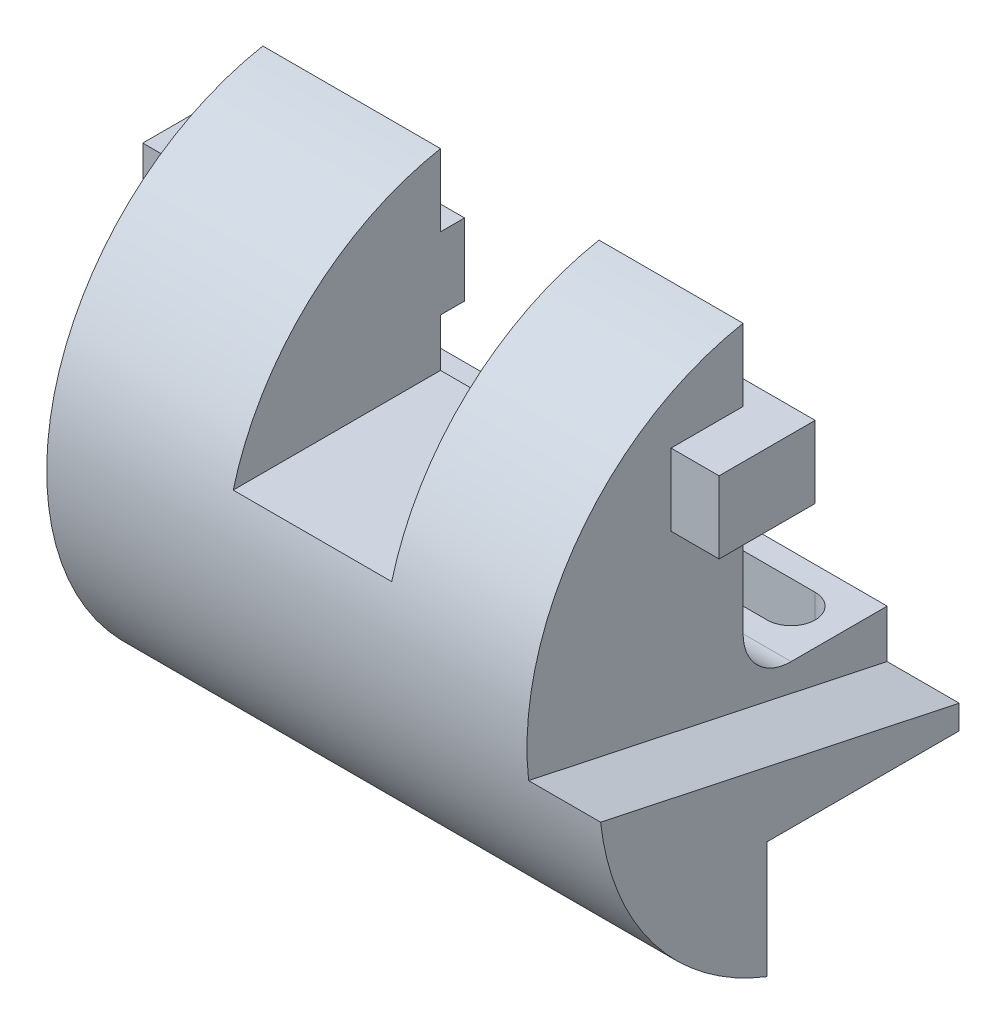
ISO-10303-21;
HEADER;
FILE_DESCRIPTION(('STEP AP214'),'2;1');
FILE_NAME('part.step','',(''),(''),'','','');
FILE_SCHEMA(('AUTOMOTIVE_DESIGN { 1 0 10303 214 1 1 1 1 }'));
ENDSEC;
DATA;
#1=APPLICATION_CONTEXT('core data for automotive mechanical design processes');
#2=APPLICATION_PROTOCOL_DEFINITION('international standard','automotive_design',2000,#1);
#3=PRODUCT_CONTEXT('',#1,'mechanical');
#4=PRODUCT('Part','Part','',(#3));
#5=PRODUCT_RELATED_PRODUCT_CATEGORY('part','',(#4));
#6=PRODUCT_DEFINITION_FORMATION('','',#4);
#7=PRODUCT_DEFINITION_CONTEXT('part definition',#1,'design');
#8=PRODUCT_DEFINITION('design','',#6,#7);
#9=PRODUCT_DEFINITION_SHAPE('','',#8);
#10=(LENGTH_UNIT() NAMED_UNIT(*) SI_UNIT(.MILLI.,.METRE.));
#11=(NAMED_UNIT(*) PLANE_ANGLE_UNIT() SI_UNIT($,.RADIAN.));
#12=(NAMED_UNIT(*) SI_UNIT($,.STERADIAN.) SOLID_ANGLE_UNIT());
#13=UNCERTAINTY_MEASURE_WITH_UNIT(LENGTH_MEASURE(1.E-05),#10,'distance_accuracy_value','');
#14=(GEOMETRIC_REPRESENTATION_CONTEXT(3) GLOBAL_UNCERTAINTY_ASSIGNED_CONTEXT((#13)) GLOBAL_UNIT_ASSIGNED_CONTEXT((#10,
#11,#12)) REPRESENTATION_CONTEXT('',''));
#15=CARTESIAN_POINT('',(0.,0.,0.));
#16=DIRECTION('',(0.,0.,1.));
#17=DIRECTION('',(1.,0.,0.));
#18=AXIS2_PLACEMENT_3D('',#15,#16,#17);
#19=CARTESIAN_POINT('',(115.,54.0832691319598,10.));
#20=DIRECTION('',(0.,0.,1.));
#21=DIRECTION('',(0.,-1.,0.));
#22=AXIS2_PLACEMENT_3D('',#19,#20,#21);
#23=PLANE('',#22);
#24=DIRECTION('',(0.,-1.,0.));
#25=VECTOR('',#24,1.);
#26=CARTESIAN_POINT('',(70.,54.0832691319598,10.));
#27=LINE('',#26,#25);
#28=CARTESIAN_POINT('',(70.,24.0832691319598,9.99999999999999));
#29=VERTEX_POINT('',#28);
#30=CARTESIAN_POINT('',(70.,14.0832691319598,9.99999999999999));
#31=VERTEX_POINT('',#30);
#32=EDGE_CURVE('E319',#29,#31,#27,.T.);
#33=ORIENTED_EDGE('',*,*,#32,.F.);
#34=DIRECTION('',(1.,0.,0.));
#35=VECTOR('',#34,1.);
#36=CARTESIAN_POINT('',(115.,24.0832691319598,10.));
#37=LINE('',#36,#35);
#38=CARTESIAN_POINT('',(100.,24.0832691319598,9.99999999999999));
#39=VERTEX_POINT('',#38);
#40=EDGE_CURVE('E279',#29,#39,#37,.T.);
#41=ORIENTED_EDGE('',*,*,#40,.T.);
#42=DIRECTION('',(0.,1.,0.));
#43=VECTOR('',#42,1.);
#44=CARTESIAN_POINT('',(100.,54.0832691319598,10.));
#45=LINE('',#44,#43);
#46=CARTESIAN_POINT('',(100.,-1.91673086804016,9.99999999999999));
#47=VERTEX_POINT('',#46);
#48=EDGE_CURVE('E382',#47,#39,#45,.T.);
#49=ORIENTED_EDGE('',*,*,#48,.F.);
#50=DIRECTION('',(-1.,0.,0.));
#51=VECTOR('',#50,1.);
#52=CARTESIAN_POINT('',(115.,-1.91673086804016,9.99999999999999));
#53=LINE('',#52,#51);
#54=CARTESIAN_POINT('',(0.,-1.91673086804016,9.99999999999999));
#55=VERTEX_POINT('',#54);
#56=EDGE_CURVE('E430',#47,#55,#53,.T.);
#57=ORIENTED_EDGE('',*,*,#56,.T.);
#58=DIRECTION('',(0.,1.,0.));
#59=VECTOR('',#58,1.);
#60=CARTESIAN_POINT('',(0.,54.0832691319598,10.));
#61=LINE('',#60,#59);
#62=CARTESIAN_POINT('',(0.,24.0832691319598,10.));
#63=VERTEX_POINT('',#62);
#64=EDGE_CURVE('E401',#55,#63,#61,.T.);
#65=ORIENTED_EDGE('',*,*,#64,.T.);
#66=DIRECTION('',(-1.,0.,0.));
#67=VECTOR('',#66,1.);
#68=CARTESIAN_POINT('',(37.,24.0832691319598,10.));
#69=LINE('',#68,#67);
#70=CARTESIAN_POINT('',(37.,24.0832691319598,10.));
#71=VERTEX_POINT('',#70);
#72=EDGE_CURVE('E304',#71,#63,#69,.T.);
#73=ORIENTED_EDGE('',*,*,#72,.F.);
#74=DIRECTION('',(0.,1.,0.));
#75=VECTOR('',#74,1.);
#76=CARTESIAN_POINT('',(37.,54.0832691319598,10.));
#77=LINE('',#76,#75);
#78=CARTESIAN_POINT('',(37.,14.0832691319598,9.99999999999999));
#79=VERTEX_POINT('',#78);
#80=EDGE_CURVE('E325',#79,#71,#77,.T.);
#81=ORIENTED_EDGE('',*,*,#80,.F.);
#82=DIRECTION('',(-1.,0.,0.));
#83=VECTOR('',#82,1.);
#84=CARTESIAN_POINT('',(70.,14.0832691319598,9.99999999999999));
#85=LINE('',#84,#83);
#86=EDGE_CURVE('E321',#31,#79,#85,.T.);
#87=ORIENTED_EDGE('',*,*,#86,.F.);
#88=EDGE_LOOP('',(#33,#41,#49,#57,#65,#73,#81,#87));
#89=FACE_BOUND('',#88,.T.);
#90=ADVANCED_FACE('F41',(#89),#23,.F.);
#91=CARTESIAN_POINT('',(0.,0.,0.));
#92=DIRECTION('',(1.,0.,0.));
#93=DIRECTION('',(0.,0.,-1.));
#94=AXIS2_PLACEMENT_3D('',#91,#92,#93);
#95=PLANE('',#94);
#96=DIRECTION('',(0.,0.,1.));
#97=VECTOR('',#96,1.);
#98=CARTESIAN_POINT('',(0.,24.0832691319598,10.));
#99=LINE('',#98,#97);
#100=CARTESIAN_POINT('',(0.,24.0832691319598,25.));
#101=VERTEX_POINT('',#100);
#102=EDGE_CURVE('E285',#63,#101,#99,.T.);
#103=ORIENTED_EDGE('',*,*,#102,.F.);
#104=ORIENTED_EDGE('',*,*,#64,.F.);
#105=CARTESIAN_POINT('',(0.,-1.91673086804016,0.));
#106=DIRECTION('',(-1.,0.,0.));
#107=DIRECTION('',(0.,0.,1.));
#108=AXIS2_PLACEMENT_3D('',#105,#106,#107);
#109=CIRCLE('',#108,10.);
#110=CARTESIAN_POINT('',(0.,-11.9167308680402,0.));
#111=VERTEX_POINT('',#110);
#112=EDGE_CURVE('E421',#111,#55,#109,.T.);
#113=ORIENTED_EDGE('',*,*,#112,.F.);
#114=DIRECTION('',(0.,0.,1.));
#115=VECTOR('',#114,1.);
#116=CARTESIAN_POINT('',(0.,-11.9167308680402,0.));
#117=LINE('',#116,#115);
#118=CARTESIAN_POINT('',(0.,-11.9167308680402,-20.));
#119=VERTEX_POINT('',#118);
#120=EDGE_CURVE('E418',#119,#111,#117,.T.);
#121=ORIENTED_EDGE('',*,*,#120,.F.);
#122=DIRECTION('',(0.,1.,0.));
#123=VECTOR('',#122,1.);
#124=CARTESIAN_POINT('',(0.,-11.9167308680402,-20.));
#125=LINE('',#124,#123);
#126=CARTESIAN_POINT('',(0.,-26.9167308680402,-20.));
#127=VERTEX_POINT('',#126);
#128=EDGE_CURVE('E415',#127,#119,#125,.T.);
#129=ORIENTED_EDGE('',*,*,#128,.F.);
#130=DIRECTION('',(0.,0.,-1.));
#131=VECTOR('',#130,1.);
#132=CARTESIAN_POINT('',(0.,-26.9167308680402,-20.));
#133=LINE('',#132,#131);
#134=CARTESIAN_POINT('',(0.,-26.9167308680402,20.));
#135=VERTEX_POINT('',#134);
#136=EDGE_CURVE('E413',#135,#127,#133,.T.);
#137=ORIENTED_EDGE('',*,*,#136,.F.);
#138=DIRECTION('',(0.,1.,0.));
#139=VECTOR('',#138,1.);
#140=CARTESIAN_POINT('',(0.,-26.9167308680402,20.));
#141=LINE('',#140,#139);
#142=CARTESIAN_POINT('',(0.,-51.234753829798,20.));
#143=VERTEX_POINT('',#142);
#144=EDGE_CURVE('E411',#143,#135,#141,.T.);
#145=ORIENTED_EDGE('',*,*,#144,.F.);
#146=CARTESIAN_POINT('',(0.,0.,0.));
#147=DIRECTION('',(1.,0.,0.));
#148=DIRECTION('',(0.,0.,-1.));
#149=AXIS2_PLACEMENT_3D('',#146,#147,#148);
#150=CIRCLE('',#149,55.);
#151=CARTESIAN_POINT('',(0.,54.0832691319598,10.));
#152=VERTEX_POINT('',#151);
#153=EDGE_CURVE('E397',#152,#143,#150,.T.);
#154=ORIENTED_EDGE('',*,*,#153,.F.);
#155=CARTESIAN_POINT('',(0.,39.0832691319598,10.));
#156=VERTEX_POINT('',#155);
#157=EDGE_CURVE('E424',#156,#152,#61,.T.);
#158=ORIENTED_EDGE('',*,*,#157,.F.);
#159=DIRECTION('',(0.,0.,-1.));
#160=VECTOR('',#159,1.);
#161=CARTESIAN_POINT('',(0.,39.0832691319598,10.));
#162=LINE('',#161,#160);
#163=CARTESIAN_POINT('',(0.,39.0832691319598,25.));
#164=VERTEX_POINT('',#163);
#165=EDGE_CURVE('E289',#164,#156,#162,.T.);
#166=ORIENTED_EDGE('',*,*,#165,.F.);
#167=DIRECTION('',(0.,1.,0.));
#168=VECTOR('',#167,1.);
#169=CARTESIAN_POINT('',(0.,39.0832691319598,25.));
#170=LINE('',#169,#168);
#171=EDGE_CURVE('E296',#101,#164,#170,.T.);
#172=ORIENTED_EDGE('',*,*,#171,.F.);
#173=EDGE_LOOP('',(#103,#104,#113,#121,#129,#137,#145,#154,#158,#166,#172));
#174=FACE_BOUND('',#173,.T.);
#175=ADVANCED_FACE('F449',(#174),#95,.F.);
#176=CARTESIAN_POINT('',(100.,39.0832691319598,9.99999999999999));
#177=VERTEX_POINT('',#176);
#178=CARTESIAN_POINT('',(100.,54.0832691319598,9.99999999999999));
#179=VERTEX_POINT('',#178);
#180=EDGE_CURVE('E381',#177,#179,#45,.T.);
#181=ORIENTED_EDGE('',*,*,#180,.F.);
#182=DIRECTION('',(-1.,0.,0.));
#183=VECTOR('',#182,1.);
#184=CARTESIAN_POINT('',(115.,39.0832691319598,10.));
#185=LINE('',#184,#183);
#186=CARTESIAN_POINT('',(70.,39.0832691319598,9.99999999999999));
#187=VERTEX_POINT('',#186);
#188=EDGE_CURVE('E274',#177,#187,#185,.T.);
#189=ORIENTED_EDGE('',*,*,#188,.T.);
#190=CARTESIAN_POINT('',(70.,54.0832691319598,10.));
#191=VERTEX_POINT('',#190);
#192=EDGE_CURVE('E234',#191,#187,#27,.T.);
#193=ORIENTED_EDGE('',*,*,#192,.F.);
#194=DIRECTION('',(-1.,0.,0.));
#195=VECTOR('',#194,1.);
#196=CARTESIAN_POINT('',(115.,54.0832691319598,10.));
#197=LINE('',#196,#195);
#198=EDGE_CURVE('E427',#179,#191,#197,.T.);
#199=ORIENTED_EDGE('',*,*,#198,.F.);
#200=EDGE_LOOP('',(#181,#189,#193,#199));
#201=FACE_BOUND('',#200,.T.);
#202=ADVANCED_FACE('F508',(#201),#23,.F.);
#203=DIRECTION('',(1.,0.,0.));
#204=VECTOR('',#203,1.);
#205=CARTESIAN_POINT('',(37.,39.0832691319598,10.));
#206=LINE('',#205,#204);
#207=CARTESIAN_POINT('',(37.,39.0832691319598,10.));
#208=VERTEX_POINT('',#207);
#209=EDGE_CURVE('E309',#156,#208,#206,.T.);
#210=ORIENTED_EDGE('',*,*,#209,.F.);
#211=ORIENTED_EDGE('',*,*,#157,.T.);
#212=CARTESIAN_POINT('',(37.,54.0832691319598,10.));
#213=VERTEX_POINT('',#212);
#214=EDGE_CURVE('E408',#213,#152,#197,.T.);
#215=ORIENTED_EDGE('',*,*,#214,.F.);
#216=EDGE_CURVE('E324',#208,#213,#77,.T.);
#217=ORIENTED_EDGE('',*,*,#216,.F.);
#218=EDGE_LOOP('',(#210,#211,#215,#217));
#219=FACE_BOUND('',#218,.T.);
#220=ADVANCED_FACE('F473',(#219),#23,.F.);
#221=CARTESIAN_POINT('',(115.,0.,0.));
#222=DIRECTION('',(-1.,0.,0.));
#223=DIRECTION('',(0.,0.,1.));
#224=AXIS2_PLACEMENT_3D('',#221,#222,#223);
#225=CYLINDRICAL_SURFACE('',#224,55.);
#226=ORIENTED_EDGE('',*,*,#198,.T.);
#227=CARTESIAN_POINT('',(70.,0.,0.));
#228=DIRECTION('',(1.,0.,0.));
#229=DIRECTION('',(0.,0.,-1.));
#230=AXIS2_PLACEMENT_3D('',#227,#228,#229);
#231=CIRCLE('',#230,55.);
#232=CARTESIAN_POINT('',(70.,14.0832691319598,53.166357130772));
#233=VERTEX_POINT('',#232);
#234=EDGE_CURVE('E339',#191,#233,#231,.T.);
#235=ORIENTED_EDGE('',*,*,#234,.T.);
#236=DIRECTION('',(-1.,0.,0.));
#237=VECTOR('',#236,1.);
#238=CARTESIAN_POINT('',(115.,14.0832691319598,53.166357130772));
#239=LINE('',#238,#237);
#240=CARTESIAN_POINT('',(37.,14.0832691319598,53.166357130772));
#241=VERTEX_POINT('',#240);
#242=EDGE_CURVE('E331',#233,#241,#239,.T.);
#243=ORIENTED_EDGE('',*,*,#242,.T.);
#244=CARTESIAN_POINT('',(37.,0.,0.));
#245=DIRECTION('',(-1.,0.,0.));
#246=DIRECTION('',(0.,0.,1.));
#247=AXIS2_PLACEMENT_3D('',#244,#245,#246);
#248=CIRCLE('',#247,55.);
#249=EDGE_CURVE('E336',#241,#213,#248,.T.);
#250=ORIENTED_EDGE('',*,*,#249,.T.);
#251=ORIENTED_EDGE('',*,*,#214,.T.);
#252=ORIENTED_EDGE('',*,*,#153,.T.);
#253=DIRECTION('',(-1.,0.,0.));
#254=VECTOR('',#253,1.);
#255=CARTESIAN_POINT('',(115.,-51.234753829798,20.));
#256=LINE('',#255,#254);
#257=CARTESIAN_POINT('',(115.,-51.234753829798,20.));
#258=VERTEX_POINT('',#257);
#259=EDGE_CURVE('E11',#258,#143,#256,.T.);
#260=ORIENTED_EDGE('',*,*,#259,.F.);
#261=CARTESIAN_POINT('',(115.,0.,0.));
#262=DIRECTION('',(1.,0.,0.));
#263=DIRECTION('',(0.,0.,-1.));
#264=AXIS2_PLACEMENT_3D('',#261,#262,#263);
#265=CIRCLE('',#264,55.);
#266=CARTESIAN_POINT('',(115.,-6.04583423455262,54.6666981663271));
#267=VERTEX_POINT('',#266);
#268=EDGE_CURVE('E398',#267,#258,#265,.T.);
#269=ORIENTED_EDGE('',*,*,#268,.F.);
#270=DIRECTION('',(1.,0.,0.));
#271=VECTOR('',#270,1.);
#272=CARTESIAN_POINT('',(100.,-6.0458342345526,54.6666981663271));
#273=LINE('',#272,#271);
#274=CARTESIAN_POINT('',(100.,-6.0458342345526,54.6666981663271));
#275=VERTEX_POINT('',#274);
#276=EDGE_CURVE('E388',#275,#267,#273,.T.);
#277=ORIENTED_EDGE('',*,*,#276,.F.);
#278=CARTESIAN_POINT('',(100.,0.,0.));
#279=DIRECTION('',(-1.,0.,0.));
#280=DIRECTION('',(0.,0.,1.));
#281=AXIS2_PLACEMENT_3D('',#278,#279,#280);
#282=CIRCLE('',#281,55.);
#283=EDGE_CURVE('E393',#275,#179,#282,.T.);
#284=ORIENTED_EDGE('',*,*,#283,.T.);
#285=EDGE_LOOP('',(#226,#235,#243,#250,#251,#252,#260,#269,#277,#284));
#286=FACE_BOUND('',#285,.T.);
#287=ADVANCED_FACE('F43',(#286),#225,.T.);
#288=CARTESIAN_POINT('',(115.,-26.9167308680402,20.));
#289=DIRECTION('',(0.,0.,1.));
#290=DIRECTION('',(1.,0.,0.));
#291=AXIS2_PLACEMENT_3D('',#288,#289,#290);
#292=PLANE('',#291);
#293=ORIENTED_EDGE('',*,*,#144,.T.);
#294=DIRECTION('',(-1.,0.,0.));
#295=VECTOR('',#294,1.);
#296=CARTESIAN_POINT('',(115.,-26.9167308680402,20.));
#297=LINE('',#296,#295);
#298=CARTESIAN_POINT('',(115.,-26.9167308680402,20.));
#299=VERTEX_POINT('',#298);
#300=EDGE_CURVE('E49',#299,#135,#297,.T.);
#301=ORIENTED_EDGE('',*,*,#300,.F.);
#302=DIRECTION('',(0.,1.,0.));
#303=VECTOR('',#302,1.);
#304=CARTESIAN_POINT('',(115.,-26.9167308680402,20.));
#305=LINE('',#304,#303);
#306=EDGE_CURVE('E400',#258,#299,#305,.T.);
#307=ORIENTED_EDGE('',*,*,#306,.F.);
#308=ORIENTED_EDGE('',*,*,#259,.T.);
#309=EDGE_LOOP('',(#293,#301,#307,#308));
#310=FACE_BOUND('',#309,.T.);
#311=ADVANCED_FACE('F463',(#310),#292,.F.);
#312=CARTESIAN_POINT('',(115.,-26.9167308680402,-20.));
#313=DIRECTION('',(0.,1.,0.));
#314=DIRECTION('',(0.,0.,1.));
#315=AXIS2_PLACEMENT_3D('',#312,#313,#314);
#316=PLANE('',#315);
#317=DIRECTION('',(-1.,0.,0.));
#318=VECTOR('',#317,1.);
#319=CARTESIAN_POINT('',(115.,-26.9167308680402,-15.));
#320=LINE('',#319,#318);
#321=CARTESIAN_POINT('',(90.,-26.9167308680402,-15.));
#322=VERTEX_POINT('',#321);
#323=CARTESIAN_POINT('',(10.,-26.9167308680402,-15.));
#324=VERTEX_POINT('',#323);
#325=EDGE_CURVE('E368',#322,#324,#320,.T.);
#326=ORIENTED_EDGE('',*,*,#325,.T.);
#327=CARTESIAN_POINT('',(10.,-26.9167308680402,-10.));
#328=DIRECTION('',(0.,1.,0.));
#329=DIRECTION('',(0.,0.,1.));
#330=AXIS2_PLACEMENT_3D('',#327,#328,#329);
#331=CIRCLE('',#330,5.);
#332=CARTESIAN_POINT('',(10.,-26.9167308680402,-5.));
#333=VERTEX_POINT('',#332);
#334=EDGE_CURVE('E371',#324,#333,#331,.T.);
#335=ORIENTED_EDGE('',*,*,#334,.T.);
#336=DIRECTION('',(1.,0.,0.));
#337=VECTOR('',#336,1.);
#338=CARTESIAN_POINT('',(115.,-26.9167308680402,-5.));
#339=LINE('',#338,#337);
#340=CARTESIAN_POINT('',(90.,-26.9167308680402,-5.));
#341=VERTEX_POINT('',#340);
#342=EDGE_CURVE('E356',#333,#341,#339,.T.);
#343=ORIENTED_EDGE('',*,*,#342,.T.);
#344=CARTESIAN_POINT('',(90.,-26.9167308680402,-10.));
#345=DIRECTION('',(0.,1.,0.));
#346=DIRECTION('',(0.,0.,1.));
#347=AXIS2_PLACEMENT_3D('',#344,#345,#346);
#348=CIRCLE('',#347,5.);
#349=EDGE_CURVE('E365',#341,#322,#348,.T.);
#350=ORIENTED_EDGE('',*,*,#349,.T.);
#351=EDGE_LOOP('',(#326,#335,#343,#350));
#352=FACE_BOUND('',#351,.T.);
#353=ORIENTED_EDGE('',*,*,#136,.T.);
#354=DIRECTION('',(-1.,0.,0.));
#355=VECTOR('',#354,1.);
#356=CARTESIAN_POINT('',(115.,-26.9167308680402,-20.));
#357=LINE('',#356,#355);
#358=CARTESIAN_POINT('',(115.,-26.9167308680402,-20.));
#359=VERTEX_POINT('',#358);
#360=EDGE_CURVE('E436',#359,#127,#357,.T.);
#361=ORIENTED_EDGE('',*,*,#360,.F.);
#362=DIRECTION('',(0.,0.,-1.));
#363=VECTOR('',#362,1.);
#364=CARTESIAN_POINT('',(115.,-26.9167308680402,-20.));
#365=LINE('',#364,#363);
#366=EDGE_CURVE('E403',#299,#359,#365,.T.);
#367=ORIENTED_EDGE('',*,*,#366,.F.);
#368=ORIENTED_EDGE('',*,*,#300,.T.);
#369=EDGE_LOOP('',(#353,#361,#367,#368));
#370=FACE_BOUND('',#369,.T.);
#371=ADVANCED_FACE('F443',(#352,#370),#316,.F.);
#372=CARTESIAN_POINT('',(115.,-11.9167308680402,-20.));
#373=DIRECTION('',(0.,0.,1.));
#374=DIRECTION('',(0.,-1.,0.));
#375=AXIS2_PLACEMENT_3D('',#372,#373,#374);
#376=PLANE('',#375);
#377=DIRECTION('',(0.,1.,0.));
#378=VECTOR('',#377,1.);
#379=CARTESIAN_POINT('',(100.,-11.9167308680402,-20.));
#380=LINE('',#379,#378);
#381=CARTESIAN_POINT('',(100.,-21.9167308680402,-20.));
#382=VERTEX_POINT('',#381);
#383=CARTESIAN_POINT('',(100.,-11.9167308680402,-20.));
#384=VERTEX_POINT('',#383);
#385=EDGE_CURVE('E375',#382,#384,#380,.T.);
#386=ORIENTED_EDGE('',*,*,#385,.F.);
#387=DIRECTION('',(1.,0.,0.));
#388=VECTOR('',#387,1.);
#389=CARTESIAN_POINT('',(100.,-21.9167308680402,-20.));
#390=LINE('',#389,#388);
#391=CARTESIAN_POINT('',(115.,-21.9167308680402,-20.));
#392=VERTEX_POINT('',#391);
#393=EDGE_CURVE('E390',#382,#392,#390,.T.);
#394=ORIENTED_EDGE('',*,*,#393,.T.);
#395=DIRECTION('',(0.,1.,0.));
#396=VECTOR('',#395,1.);
#397=CARTESIAN_POINT('',(115.,-11.9167308680402,-20.));
#398=LINE('',#397,#396);
#399=EDGE_CURVE('E405',#359,#392,#398,.T.);
#400=ORIENTED_EDGE('',*,*,#399,.F.);
#401=ORIENTED_EDGE('',*,*,#360,.T.);
#402=ORIENTED_EDGE('',*,*,#128,.T.);
#403=DIRECTION('',(-1.,0.,0.));
#404=VECTOR('',#403,1.);
#405=CARTESIAN_POINT('',(115.,-11.9167308680402,-20.));
#406=LINE('',#405,#404);
#407=EDGE_CURVE('E434',#384,#119,#406,.T.);
#408=ORIENTED_EDGE('',*,*,#407,.F.);
#409=EDGE_LOOP('',(#386,#394,#400,#401,#402,#408));
#410=FACE_BOUND('',#409,.T.);
#411=ADVANCED_FACE('F456',(#410),#376,.F.);
#412=CARTESIAN_POINT('',(115.,-11.9167308680402,0.));
#413=DIRECTION('',(0.,-1.,0.));
#414=DIRECTION('',(0.,0.,-1.));
#415=AXIS2_PLACEMENT_3D('',#412,#413,#414);
#416=PLANE('',#415);
#417=DIRECTION('',(1.,0.,0.));
#418=VECTOR('',#417,1.);
#419=CARTESIAN_POINT('',(10.,-11.9167308680402,-5.));
#420=LINE('',#419,#418);
#421=CARTESIAN_POINT('',(10.,-11.9167308680402,-5.));
#422=VERTEX_POINT('',#421);
#423=CARTESIAN_POINT('',(90.,-11.9167308680402,-5.));
#424=VERTEX_POINT('',#423);
#425=EDGE_CURVE('E344',#422,#424,#420,.T.);
#426=ORIENTED_EDGE('',*,*,#425,.F.);
#427=CARTESIAN_POINT('',(10.,-11.9167308680402,-10.));
#428=DIRECTION('',(0.,1.,0.));
#429=DIRECTION('',(0.,0.,1.));
#430=AXIS2_PLACEMENT_3D('',#427,#428,#429);
#431=CIRCLE('',#430,5.);
#432=CARTESIAN_POINT('',(10.,-11.9167308680402,-15.));
#433=VERTEX_POINT('',#432);
#434=EDGE_CURVE('E342',#433,#422,#431,.T.);
#435=ORIENTED_EDGE('',*,*,#434,.F.);
#436=DIRECTION('',(-1.,0.,0.));
#437=VECTOR('',#436,1.);
#438=CARTESIAN_POINT('',(10.,-11.9167308680402,-15.));
#439=LINE('',#438,#437);
#440=CARTESIAN_POINT('',(90.,-11.9167308680402,-15.));
#441=VERTEX_POINT('',#440);
#442=EDGE_CURVE('E350',#441,#433,#439,.T.);
#443=ORIENTED_EDGE('',*,*,#442,.F.);
#444=CARTESIAN_POINT('',(90.,-11.9167308680402,-10.));
#445=DIRECTION('',(0.,1.,0.));
#446=DIRECTION('',(0.,0.,1.));
#447=AXIS2_PLACEMENT_3D('',#444,#445,#446);
#448=CIRCLE('',#447,5.);
#449=EDGE_CURVE('E347',#424,#441,#448,.T.);
#450=ORIENTED_EDGE('',*,*,#449,.F.);
#451=EDGE_LOOP('',(#426,#435,#443,#450));
#452=FACE_BOUND('',#451,.T.);
#453=DIRECTION('',(-1.,0.,0.));
#454=VECTOR('',#453,1.);
#455=CARTESIAN_POINT('',(115.,-11.9167308680402,0.));
#456=LINE('',#455,#454);
#457=CARTESIAN_POINT('',(100.,-11.9167308680402,0.));
#458=VERTEX_POINT('',#457);
#459=EDGE_CURVE('E432',#458,#111,#456,.T.);
#460=ORIENTED_EDGE('',*,*,#459,.F.);
#461=DIRECTION('',(0.,0.,1.));
#462=VECTOR('',#461,1.);
#463=CARTESIAN_POINT('',(100.,-11.9167308680402,0.));
#464=LINE('',#463,#462);
#465=EDGE_CURVE('E377',#384,#458,#464,.T.);
#466=ORIENTED_EDGE('',*,*,#465,.F.);
#467=ORIENTED_EDGE('',*,*,#407,.T.);
#468=ORIENTED_EDGE('',*,*,#120,.T.);
#469=EDGE_LOOP('',(#460,#466,#467,#468));
#470=FACE_BOUND('',#469,.T.);
#471=ADVANCED_FACE('F499',(#452,#470),#416,.F.);
#472=CARTESIAN_POINT('',(115.,-1.91673086804016,0.));
#473=DIRECTION('',(-1.,0.,0.));
#474=DIRECTION('',(0.,0.,1.));
#475=AXIS2_PLACEMENT_3D('',#472,#473,#474);
#476=CYLINDRICAL_SURFACE('',#475,10.);
#477=ORIENTED_EDGE('',*,*,#56,.F.);
#478=CARTESIAN_POINT('',(100.,-1.91673086804016,0.));
#479=DIRECTION('',(-1.,0.,0.));
#480=DIRECTION('',(0.,0.,-1.));
#481=AXIS2_PLACEMENT_3D('',#478,#479,#480);
#482=CIRCLE('',#481,10.);
#483=EDGE_CURVE('E379',#458,#47,#482,.T.);
#484=ORIENTED_EDGE('',*,*,#483,.F.);
#485=ORIENTED_EDGE('',*,*,#459,.T.);
#486=ORIENTED_EDGE('',*,*,#112,.T.);
#487=EDGE_LOOP('',(#477,#484,#485,#486));
#488=FACE_BOUND('',#487,.T.);
#489=ADVANCED_FACE('F495',(#488),#476,.F.);
#490=CARTESIAN_POINT('',(115.,0.,0.));
#491=DIRECTION('',(1.,0.,0.));
#492=DIRECTION('',(0.,0.,-1.));
#493=AXIS2_PLACEMENT_3D('',#490,#491,#492);
#494=PLANE('',#493);
#495=DIRECTION('',(0.,-0.207911690817756,-0.978147600733806));
#496=VECTOR('',#495,1.);
#497=CARTESIAN_POINT('',(115.,-21.9167308680402,-20.));
#498=LINE('',#497,#496);
#499=EDGE_CURVE('E374',#267,#392,#498,.T.);
#500=ORIENTED_EDGE('',*,*,#499,.F.);
#501=ORIENTED_EDGE('',*,*,#268,.T.);
#502=ORIENTED_EDGE('',*,*,#306,.T.);
#503=ORIENTED_EDGE('',*,*,#366,.T.);
#504=ORIENTED_EDGE('',*,*,#399,.T.);
#505=EDGE_LOOP('',(#500,#501,#502,#503,#504));
#506=FACE_BOUND('',#505,.T.);
#507=ADVANCED_FACE('F460',(#506),#494,.T.);
#508=CARTESIAN_POINT('',(100.,4.26495837941625,5.7413718447432));
#509=DIRECTION('',(-1.,0.,0.));
#510=DIRECTION('',(0.,0.,1.));
#511=AXIS2_PLACEMENT_3D('',#508,#509,#510);
#512=PLANE('',#511);
#513=ORIENTED_EDGE('',*,*,#48,.T.);
#514=DIRECTION('',(0.,0.,1.));
#515=VECTOR('',#514,1.);
#516=CARTESIAN_POINT('',(100.,24.0832691319598,5.7413718447432));
#517=LINE('',#516,#515);
#518=CARTESIAN_POINT('',(100.,24.0832691319598,25.));
#519=VERTEX_POINT('',#518);
#520=EDGE_CURVE('E276',#39,#519,#517,.T.);
#521=ORIENTED_EDGE('',*,*,#520,.T.);
#522=DIRECTION('',(0.,1.,0.));
#523=VECTOR('',#522,1.);
#524=CARTESIAN_POINT('',(100.,4.26495837941625,25.));
#525=LINE('',#524,#523);
#526=CARTESIAN_POINT('',(100.,39.0832691319598,25.));
#527=VERTEX_POINT('',#526);
#528=EDGE_CURVE('E265',#519,#527,#525,.T.);
#529=ORIENTED_EDGE('',*,*,#528,.T.);
#530=DIRECTION('',(0.,0.,-1.));
#531=VECTOR('',#530,1.);
#532=CARTESIAN_POINT('',(100.,39.0832691319598,5.74137184474321));
#533=LINE('',#532,#531);
#534=EDGE_CURVE('E271',#527,#177,#533,.T.);
#535=ORIENTED_EDGE('',*,*,#534,.T.);
#536=ORIENTED_EDGE('',*,*,#180,.T.);
#537=ORIENTED_EDGE('',*,*,#283,.F.);
#538=DIRECTION('',(0.,-0.207911690817756,-0.978147600733806));
#539=VECTOR('',#538,1.);
#540=CARTESIAN_POINT('',(100.,-21.9167308680402,-20.));
#541=LINE('',#540,#539);
#542=EDGE_CURVE('E385',#275,#382,#541,.T.);
#543=ORIENTED_EDGE('',*,*,#542,.T.);
#544=ORIENTED_EDGE('',*,*,#385,.T.);
#545=ORIENTED_EDGE('',*,*,#465,.T.);
#546=ORIENTED_EDGE('',*,*,#483,.T.);
#547=EDGE_LOOP('',(#513,#521,#529,#535,#536,#537,#543,#544,#545,#546));
#548=FACE_BOUND('',#547,.T.);
#549=ADVANCED_FACE('F501',(#548),#512,.F.);
#550=CARTESIAN_POINT('',(100.,-21.9167308680402,-20.));
#551=DIRECTION('',(0.,-0.978147600733806,0.207911690817756));
#552=DIRECTION('',(0.,-0.207911690817756,-0.978147600733807));
#553=AXIS2_PLACEMENT_3D('',#550,#551,#552);
#554=PLANE('',#553);
#555=ORIENTED_EDGE('',*,*,#499,.T.);
#556=ORIENTED_EDGE('',*,*,#393,.F.);
#557=ORIENTED_EDGE('',*,*,#542,.F.);
#558=ORIENTED_EDGE('',*,*,#276,.T.);
#559=EDGE_LOOP('',(#555,#556,#557,#558));
#560=FACE_BOUND('',#559,.T.);
#561=ADVANCED_FACE('F504',(#560),#554,.F.);
#562=CARTESIAN_POINT('',(10.,-78.9167308680402,-9.99999999999999));
#563=DIRECTION('',(0.,1.,0.));
#564=DIRECTION('',(0.,0.,1.));
#565=AXIS2_PLACEMENT_3D('',#562,#563,#564);
#566=CYLINDRICAL_SURFACE('',#565,5.);
#567=DIRECTION('',(0.,1.,0.));
#568=VECTOR('',#567,1.);
#569=CARTESIAN_POINT('',(10.,-78.9167308680402,-15.));
#570=LINE('',#569,#568);
#571=EDGE_CURVE('E354',#324,#433,#570,.T.);
#572=ORIENTED_EDGE('',*,*,#571,.T.);
#573=ORIENTED_EDGE('',*,*,#434,.T.);
#574=DIRECTION('',(0.,1.,0.));
#575=VECTOR('',#574,1.);
#576=CARTESIAN_POINT('',(10.,-78.9167308680402,-4.99999999999999));
#577=LINE('',#576,#575);
#578=EDGE_CURVE('E353',#333,#422,#577,.T.);
#579=ORIENTED_EDGE('',*,*,#578,.F.);
#580=ORIENTED_EDGE('',*,*,#334,.F.);
#581=EDGE_LOOP('',(#572,#573,#579,#580));
#582=FACE_BOUND('',#581,.T.);
#583=ADVANCED_FACE('F600',(#582),#566,.F.);
#584=CARTESIAN_POINT('',(10.,-78.9167308680402,-15.));
#585=DIRECTION('',(0.,0.,-1.));
#586=DIRECTION('',(0.,1.,0.));
#587=AXIS2_PLACEMENT_3D('',#584,#585,#586);
#588=PLANE('',#587);
#589=DIRECTION('',(0.,1.,0.));
#590=VECTOR('',#589,1.);
#591=CARTESIAN_POINT('',(90.,-78.9167308680402,-15.));
#592=LINE('',#591,#590);
#593=EDGE_CURVE('E357',#322,#441,#592,.T.);
#594=ORIENTED_EDGE('',*,*,#593,.T.);
#595=ORIENTED_EDGE('',*,*,#442,.T.);
#596=ORIENTED_EDGE('',*,*,#571,.F.);
#597=ORIENTED_EDGE('',*,*,#325,.F.);
#598=EDGE_LOOP('',(#594,#595,#596,#597));
#599=FACE_BOUND('',#598,.T.);
#600=ADVANCED_FACE('F606',(#599),#588,.F.);
#601=CARTESIAN_POINT('',(90.,-78.9167308680402,-9.99999999999999));
#602=DIRECTION('',(0.,1.,0.));
#603=DIRECTION('',(0.,0.,1.));
#604=AXIS2_PLACEMENT_3D('',#601,#602,#603);
#605=CYLINDRICAL_SURFACE('',#604,5.);
#606=DIRECTION('',(0.,1.,0.));
#607=VECTOR('',#606,1.);
#608=CARTESIAN_POINT('',(90.,-78.9167308680402,-4.99999999999999));
#609=LINE('',#608,#607);
#610=EDGE_CURVE('E359',#341,#424,#609,.T.);
#611=ORIENTED_EDGE('',*,*,#610,.T.);
#612=ORIENTED_EDGE('',*,*,#449,.T.);
#613=ORIENTED_EDGE('',*,*,#593,.F.);
#614=ORIENTED_EDGE('',*,*,#349,.F.);
#615=EDGE_LOOP('',(#611,#612,#613,#614));
#616=FACE_BOUND('',#615,.T.);
#617=ADVANCED_FACE('F614',(#616),#605,.F.);
#618=CARTESIAN_POINT('',(10.,-78.9167308680402,-4.99999999999999));
#619=DIRECTION('',(0.,0.,1.));
#620=DIRECTION('',(0.,-1.,0.));
#621=AXIS2_PLACEMENT_3D('',#618,#619,#620);
#622=PLANE('',#621);
#623=ORIENTED_EDGE('',*,*,#578,.T.);
#624=ORIENTED_EDGE('',*,*,#425,.T.);
#625=ORIENTED_EDGE('',*,*,#610,.F.);
#626=ORIENTED_EDGE('',*,*,#342,.F.);
#627=EDGE_LOOP('',(#623,#624,#625,#626));
#628=FACE_BOUND('',#627,.T.);
#629=ADVANCED_FACE('F622',(#628),#622,.F.);
#630=CARTESIAN_POINT('',(70.,54.0832691319598,77.));
#631=DIRECTION('',(1.,0.,0.));
#632=DIRECTION('',(0.,0.,-1.));
#633=AXIS2_PLACEMENT_3D('',#630,#631,#632);
#634=PLANE('',#633);
#635=ORIENTED_EDGE('',*,*,#192,.T.);
#636=DIRECTION('',(0.,0.,-1.));
#637=VECTOR('',#636,1.);
#638=CARTESIAN_POINT('',(70.,39.0832691319598,25.));
#639=LINE('',#638,#637);
#640=CARTESIAN_POINT('',(70.,39.0832691319598,5.));
#641=VERTEX_POINT('',#640);
#642=EDGE_CURVE('E227',#187,#641,#639,.T.);
#643=ORIENTED_EDGE('',*,*,#642,.T.);
#644=DIRECTION('',(0.,1.,0.));
#645=VECTOR('',#644,1.);
#646=CARTESIAN_POINT('',(70.,39.0832691319598,5.));
#647=LINE('',#646,#645);
#648=CARTESIAN_POINT('',(70.,24.0832691319598,5.));
#649=VERTEX_POINT('',#648);
#650=EDGE_CURVE('E232',#649,#641,#647,.T.);
#651=ORIENTED_EDGE('',*,*,#650,.F.);
#652=DIRECTION('',(0.,0.,-1.));
#653=VECTOR('',#652,1.);
#654=CARTESIAN_POINT('',(70.,24.0832691319598,25.));
#655=LINE('',#654,#653);
#656=EDGE_CURVE('E263',#29,#649,#655,.T.);
#657=ORIENTED_EDGE('',*,*,#656,.F.);
#658=ORIENTED_EDGE('',*,*,#32,.T.);
#659=DIRECTION('',(0.,0.,-1.));
#660=VECTOR('',#659,1.);
#661=CARTESIAN_POINT('',(70.,14.0832691319598,77.));
#662=LINE('',#661,#660);
#663=EDGE_CURVE('E328',#233,#31,#662,.T.);
#664=ORIENTED_EDGE('',*,*,#663,.F.);
#665=ORIENTED_EDGE('',*,*,#234,.F.);
#666=EDGE_LOOP('',(#635,#643,#651,#657,#658,#664,#665));
#667=FACE_BOUND('',#666,.T.);
#668=ADVANCED_FACE('F229',(#667),#634,.F.);
#669=CARTESIAN_POINT('',(37.,54.0832691319598,77.));
#670=DIRECTION('',(-1.,0.,0.));
#671=DIRECTION('',(0.,0.,1.));
#672=AXIS2_PLACEMENT_3D('',#669,#670,#671);
#673=PLANE('',#672);
#674=DIRECTION('',(0.,0.,-1.));
#675=VECTOR('',#674,1.);
#676=CARTESIAN_POINT('',(37.,14.0832691319598,77.));
#677=LINE('',#676,#675);
#678=EDGE_CURVE('E329',#241,#79,#677,.T.);
#679=ORIENTED_EDGE('',*,*,#678,.T.);
#680=ORIENTED_EDGE('',*,*,#80,.T.);
#681=DIRECTION('',(0.,0.,1.));
#682=VECTOR('',#681,1.);
#683=CARTESIAN_POINT('',(37.,24.0832691319598,5.));
#684=LINE('',#683,#682);
#685=CARTESIAN_POINT('',(37.,24.0832691319598,5.));
#686=VERTEX_POINT('',#685);
#687=EDGE_CURVE('E317',#686,#71,#684,.T.);
#688=ORIENTED_EDGE('',*,*,#687,.F.);
#689=DIRECTION('',(0.,-1.,0.));
#690=VECTOR('',#689,1.);
#691=CARTESIAN_POINT('',(37.,39.0832691319598,5.));
#692=LINE('',#691,#690);
#693=CARTESIAN_POINT('',(37.,39.0832691319598,5.));
#694=VERTEX_POINT('',#693);
#695=EDGE_CURVE('E305',#694,#686,#692,.T.);
#696=ORIENTED_EDGE('',*,*,#695,.F.);
#697=DIRECTION('',(0.,0.,1.));
#698=VECTOR('',#697,1.);
#699=CARTESIAN_POINT('',(37.,39.0832691319598,5.));
#700=LINE('',#699,#698);
#701=EDGE_CURVE('E64',#694,#208,#700,.T.);
#702=ORIENTED_EDGE('',*,*,#701,.T.);
#703=ORIENTED_EDGE('',*,*,#216,.T.);
#704=ORIENTED_EDGE('',*,*,#249,.F.);
#705=EDGE_LOOP('',(#679,#680,#688,#696,#702,#703,#704));
#706=FACE_BOUND('',#705,.T.);
#707=ADVANCED_FACE('F635',(#706),#673,.F.);
#708=CARTESIAN_POINT('',(70.,14.0832691319598,77.));
#709=DIRECTION('',(0.,-1.,0.));
#710=DIRECTION('',(0.,0.,-1.));
#711=AXIS2_PLACEMENT_3D('',#708,#709,#710);
#712=PLANE('',#711);
#713=ORIENTED_EDGE('',*,*,#663,.T.);
#714=ORIENTED_EDGE('',*,*,#86,.T.);
#715=ORIENTED_EDGE('',*,*,#678,.F.);
#716=ORIENTED_EDGE('',*,*,#242,.F.);
#717=EDGE_LOOP('',(#713,#714,#715,#716));
#718=FACE_BOUND('',#717,.T.);
#719=ADVANCED_FACE('F643',(#718),#712,.F.);
#720=CARTESIAN_POINT('',(37.,24.0832691319598,5.));
#721=DIRECTION('',(0.,1.,0.));
#722=DIRECTION('',(0.,0.,1.));
#723=AXIS2_PLACEMENT_3D('',#720,#721,#722);
#724=PLANE('',#723);
#725=ORIENTED_EDGE('',*,*,#72,.T.);
#726=ORIENTED_EDGE('',*,*,#102,.T.);
#727=DIRECTION('',(1.,0.,0.));
#728=VECTOR('',#727,1.);
#729=CARTESIAN_POINT('',(-10.,24.0832691319598,25.));
#730=LINE('',#729,#728);
#731=CARTESIAN_POINT('',(-10.,24.0832691319598,25.));
#732=VERTEX_POINT('',#731);
#733=EDGE_CURVE('E301',#732,#101,#730,.T.);
#734=ORIENTED_EDGE('',*,*,#733,.F.);
#735=DIRECTION('',(0.,0.,1.));
#736=VECTOR('',#735,1.);
#737=CARTESIAN_POINT('',(-10.,24.0832691319598,10.));
#738=LINE('',#737,#736);
#739=CARTESIAN_POINT('',(-10.,24.0832691319598,5.));
#740=VERTEX_POINT('',#739);
#741=EDGE_CURVE('E286',#740,#732,#738,.T.);
#742=ORIENTED_EDGE('',*,*,#741,.F.);
#743=DIRECTION('',(-1.,0.,0.));
#744=VECTOR('',#743,1.);
#745=CARTESIAN_POINT('',(37.,24.0832691319598,5.));
#746=LINE('',#745,#744);
#747=EDGE_CURVE('E308',#686,#740,#746,.T.);
#748=ORIENTED_EDGE('',*,*,#747,.F.);
#749=ORIENTED_EDGE('',*,*,#687,.T.);
#750=EDGE_LOOP('',(#725,#726,#734,#742,#748,#749));
#751=FACE_BOUND('',#750,.T.);
#752=ADVANCED_FACE('F486',(#751),#724,.F.);
#753=CARTESIAN_POINT('',(37.,39.0832691319598,5.));
#754=DIRECTION('',(0.,-1.,0.));
#755=DIRECTION('',(1.,0.,0.));
#756=AXIS2_PLACEMENT_3D('',#753,#754,#755);
#757=PLANE('',#756);
#758=DIRECTION('',(1.,0.,0.));
#759=VECTOR('',#758,1.);
#760=CARTESIAN_POINT('',(37.,39.0832691319598,5.));
#761=LINE('',#760,#759);
#762=CARTESIAN_POINT('',(-10.,39.0832691319598,5.));
#763=VERTEX_POINT('',#762);
#764=EDGE_CURVE('E311',#763,#694,#761,.T.);
#765=ORIENTED_EDGE('',*,*,#764,.F.);
#766=DIRECTION('',(0.,0.,-1.));
#767=VECTOR('',#766,1.);
#768=CARTESIAN_POINT('',(-10.,39.0832691319598,10.));
#769=LINE('',#768,#767);
#770=CARTESIAN_POINT('',(-10.,39.0832691319598,25.));
#771=VERTEX_POINT('',#770);
#772=EDGE_CURVE('E291',#771,#763,#769,.T.);
#773=ORIENTED_EDGE('',*,*,#772,.F.);
#774=DIRECTION('',(1.,0.,0.));
#775=VECTOR('',#774,1.);
#776=CARTESIAN_POINT('',(-10.,39.0832691319598,25.));
#777=LINE('',#776,#775);
#778=EDGE_CURVE('E294',#771,#164,#777,.T.);
#779=ORIENTED_EDGE('',*,*,#778,.T.);
#780=ORIENTED_EDGE('',*,*,#165,.T.);
#781=ORIENTED_EDGE('',*,*,#209,.T.);
#782=ORIENTED_EDGE('',*,*,#701,.F.);
#783=EDGE_LOOP('',(#765,#773,#779,#780,#781,#782));
#784=FACE_BOUND('',#783,.T.);
#785=ADVANCED_FACE('F476',(#784),#757,.F.);
#786=CARTESIAN_POINT('',(0.,0.,4.99999999999999));
#787=DIRECTION('',(0.,0.,-1.));
#788=DIRECTION('',(0.,1.,0.));
#789=AXIS2_PLACEMENT_3D('',#786,#787,#788);
#790=PLANE('',#789);
#791=ORIENTED_EDGE('',*,*,#695,.T.);
#792=ORIENTED_EDGE('',*,*,#747,.T.);
#793=DIRECTION('',(0.,1.,0.));
#794=VECTOR('',#793,1.);
#795=CARTESIAN_POINT('',(-10.,39.0832691319598,5.));
#796=LINE('',#795,#794);
#797=EDGE_CURVE('E282',#740,#763,#796,.T.);
#798=ORIENTED_EDGE('',*,*,#797,.T.);
#799=ORIENTED_EDGE('',*,*,#764,.T.);
#800=EDGE_LOOP('',(#791,#792,#798,#799));
#801=FACE_BOUND('',#800,.T.);
#802=ADVANCED_FACE('F662',(#801),#790,.T.);
#803=CARTESIAN_POINT('',(-10.,39.0832691319598,25.));
#804=DIRECTION('',(0.,0.,-1.));
#805=DIRECTION('',(0.,1.,0.));
#806=AXIS2_PLACEMENT_3D('',#803,#804,#805);
#807=PLANE('',#806);
#808=ORIENTED_EDGE('',*,*,#171,.T.);
#809=ORIENTED_EDGE('',*,*,#778,.F.);
#810=DIRECTION('',(0.,1.,0.));
#811=VECTOR('',#810,1.);
#812=CARTESIAN_POINT('',(-10.,39.0832691319598,25.));
#813=LINE('',#812,#811);
#814=EDGE_CURVE('E288',#732,#771,#813,.T.);
#815=ORIENTED_EDGE('',*,*,#814,.F.);
#816=ORIENTED_EDGE('',*,*,#733,.T.);
#817=EDGE_LOOP('',(#808,#809,#815,#816));
#818=FACE_BOUND('',#817,.T.);
#819=ADVANCED_FACE('F481',(#818),#807,.F.);
#820=CARTESIAN_POINT('',(-10.,0.,0.));
#821=DIRECTION('',(-1.,0.,0.));
#822=DIRECTION('',(0.,0.,1.));
#823=AXIS2_PLACEMENT_3D('',#820,#821,#822);
#824=PLANE('',#823);
#825=ORIENTED_EDGE('',*,*,#772,.T.);
#826=ORIENTED_EDGE('',*,*,#797,.F.);
#827=ORIENTED_EDGE('',*,*,#741,.T.);
#828=ORIENTED_EDGE('',*,*,#814,.T.);
#829=EDGE_LOOP('',(#825,#826,#827,#828));
#830=FACE_BOUND('',#829,.T.);
#831=ADVANCED_FACE('F676',(#830),#824,.T.);
#832=CARTESIAN_POINT('',(70.,24.0832691319598,25.));
#833=DIRECTION('',(0.,-1.,0.));
#834=DIRECTION('',(1.,0.,0.));
#835=AXIS2_PLACEMENT_3D('',#832,#833,#834);
#836=PLANE('',#835);
#837=ORIENTED_EDGE('',*,*,#40,.F.);
#838=ORIENTED_EDGE('',*,*,#656,.T.);
#839=DIRECTION('',(-1.,0.,0.));
#840=VECTOR('',#839,1.);
#841=CARTESIAN_POINT('',(70.,24.0832691319598,5.));
#842=LINE('',#841,#840);
#843=CARTESIAN_POINT('',(110.,24.0832691319598,5.));
#844=VERTEX_POINT('',#843);
#845=EDGE_CURVE('E252',#844,#649,#842,.T.);
#846=ORIENTED_EDGE('',*,*,#845,.F.);
#847=DIRECTION('',(0.,0.,-1.));
#848=VECTOR('',#847,1.);
#849=CARTESIAN_POINT('',(110.,24.0832691319598,25.));
#850=LINE('',#849,#848);
#851=CARTESIAN_POINT('',(110.,24.0832691319598,25.));
#852=VERTEX_POINT('',#851);
#853=EDGE_CURVE('E266',#852,#844,#850,.T.);
#854=ORIENTED_EDGE('',*,*,#853,.F.);
#855=DIRECTION('',(-1.,0.,0.));
#856=VECTOR('',#855,1.);
#857=CARTESIAN_POINT('',(70.,24.0832691319598,25.));
#858=LINE('',#857,#856);
#859=EDGE_CURVE('E238',#852,#519,#858,.T.);
#860=ORIENTED_EDGE('',*,*,#859,.T.);
#861=ORIENTED_EDGE('',*,*,#520,.F.);
#862=EDGE_LOOP('',(#837,#838,#846,#854,#860,#861));
#863=FACE_BOUND('',#862,.T.);
#864=ADVANCED_FACE('F512',(#863),#836,.T.);
#865=CARTESIAN_POINT('',(70.,39.0832691319598,25.));
#866=DIRECTION('',(0.,1.,0.));
#867=DIRECTION('',(-1.,0.,0.));
#868=AXIS2_PLACEMENT_3D('',#865,#866,#867);
#869=PLANE('',#868);
#870=ORIENTED_EDGE('',*,*,#188,.F.);
#871=ORIENTED_EDGE('',*,*,#534,.F.);
#872=DIRECTION('',(1.,0.,0.));
#873=VECTOR('',#872,1.);
#874=CARTESIAN_POINT('',(70.,39.0832691319598,25.));
#875=LINE('',#874,#873);
#876=CARTESIAN_POINT('',(110.,39.0832691319598,25.));
#877=VERTEX_POINT('',#876);
#878=EDGE_CURVE('E56',#527,#877,#875,.T.);
#879=ORIENTED_EDGE('',*,*,#878,.T.);
#880=DIRECTION('',(0.,0.,-1.));
#881=VECTOR('',#880,1.);
#882=CARTESIAN_POINT('',(110.,39.0832691319598,25.));
#883=LINE('',#882,#881);
#884=CARTESIAN_POINT('',(110.,39.0832691319598,5.));
#885=VERTEX_POINT('',#884);
#886=EDGE_CURVE('E237',#877,#885,#883,.T.);
#887=ORIENTED_EDGE('',*,*,#886,.T.);
#888=DIRECTION('',(1.,0.,0.));
#889=VECTOR('',#888,1.);
#890=CARTESIAN_POINT('',(70.,39.0832691319598,5.));
#891=LINE('',#890,#889);
#892=EDGE_CURVE('E241',#641,#885,#891,.T.);
#893=ORIENTED_EDGE('',*,*,#892,.F.);
#894=ORIENTED_EDGE('',*,*,#642,.F.);
#895=EDGE_LOOP('',(#870,#871,#879,#887,#893,#894));
#896=FACE_BOUND('',#895,.T.);
#897=ADVANCED_FACE('F242',(#896),#869,.T.);
#898=CARTESIAN_POINT('',(0.,0.,25.));
#899=DIRECTION('',(0.,0.,1.));
#900=DIRECTION('',(0.,-1.,0.));
#901=AXIS2_PLACEMENT_3D('',#898,#899,#900);
#902=PLANE('',#901);
#903=ORIENTED_EDGE('',*,*,#528,.F.);
#904=ORIENTED_EDGE('',*,*,#859,.F.);
#905=DIRECTION('',(0.,-1.,0.));
#906=VECTOR('',#905,1.);
#907=CARTESIAN_POINT('',(110.,39.0832691319598,25.));
#908=LINE('',#907,#906);
#909=EDGE_CURVE('E258',#877,#852,#908,.T.);
#910=ORIENTED_EDGE('',*,*,#909,.F.);
#911=ORIENTED_EDGE('',*,*,#878,.F.);
#912=EDGE_LOOP('',(#903,#904,#910,#911));
#913=FACE_BOUND('',#912,.T.);
#914=ADVANCED_FACE('F510',(#913),#902,.T.);
#915=CARTESIAN_POINT('',(110.,39.0832691319598,25.));
#916=DIRECTION('',(1.,0.,0.));
#917=DIRECTION('',(0.,0.,-1.));
#918=AXIS2_PLACEMENT_3D('',#915,#916,#917);
#919=PLANE('',#918);
#920=ORIENTED_EDGE('',*,*,#853,.T.);
#921=DIRECTION('',(0.,-1.,0.));
#922=VECTOR('',#921,1.);
#923=CARTESIAN_POINT('',(110.,39.0832691319598,5.));
#924=LINE('',#923,#922);
#925=EDGE_CURVE('E247',#885,#844,#924,.T.);
#926=ORIENTED_EDGE('',*,*,#925,.F.);
#927=ORIENTED_EDGE('',*,*,#886,.F.);
#928=ORIENTED_EDGE('',*,*,#909,.T.);
#929=EDGE_LOOP('',(#920,#926,#927,#928));
#930=FACE_BOUND('',#929,.T.);
#931=ADVANCED_FACE('F514',(#930),#919,.T.);
#932=CARTESIAN_POINT('',(0.,0.,5.));
#933=DIRECTION('',(0.,0.,1.));
#934=DIRECTION('',(0.,-1.,0.));
#935=AXIS2_PLACEMENT_3D('',#932,#933,#934);
#936=PLANE('',#935);
#937=ORIENTED_EDGE('',*,*,#650,.T.);
#938=ORIENTED_EDGE('',*,*,#892,.T.);
#939=ORIENTED_EDGE('',*,*,#925,.T.);
#940=ORIENTED_EDGE('',*,*,#845,.T.);
#941=EDGE_LOOP('',(#937,#938,#939,#940));
#942=FACE_BOUND('',#941,.T.);
#943=ADVANCED_FACE('F250',(#942),#936,.F.);
#944=CLOSED_SHELL('',(#90,#175,#202,#220,#287,#311,#371,#411,#471,#489,#507,#549,#561,#583,#600,
#617,#629,#668,#707,#719,#752,#785,#802,#819,#831,#864,#897,#914,#931,#943));
#945=MANIFOLD_SOLID_BREP('B2',#944);
#946=ADVANCED_BREP_SHAPE_REPRESENTATION('',(#18,#945),#14);
#947=SHAPE_DEFINITION_REPRESENTATION(#9,#946);
ENDSEC;
END-ISO-10303-21;
